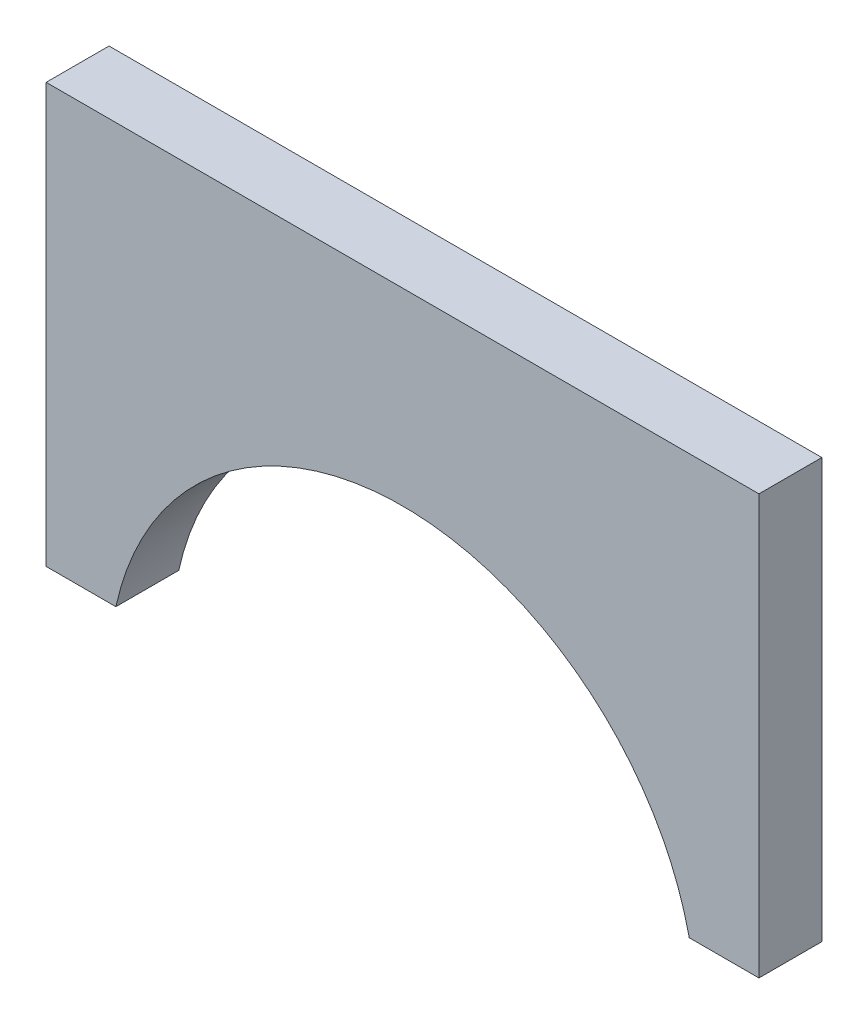
ISO-10303-21;
HEADER;
FILE_DESCRIPTION(('STEP AP214'),'2;1');
FILE_NAME('part.step','',(''),(''),'','','');
FILE_SCHEMA(('AUTOMOTIVE_DESIGN { 1 0 10303 214 1 1 1 1 }'));
ENDSEC;
DATA;
#1=APPLICATION_CONTEXT('core data for automotive mechanical design processes');
#2=APPLICATION_PROTOCOL_DEFINITION('international standard','automotive_design',2000,#1);
#3=PRODUCT_CONTEXT('',#1,'mechanical');
#4=PRODUCT('Part','Part','',(#3));
#5=PRODUCT_RELATED_PRODUCT_CATEGORY('part','',(#4));
#6=PRODUCT_DEFINITION_FORMATION('','',#4);
#7=PRODUCT_DEFINITION_CONTEXT('part definition',#1,'design');
#8=PRODUCT_DEFINITION('design','',#6,#7);
#9=PRODUCT_DEFINITION_SHAPE('','',#8);
#10=(LENGTH_UNIT() NAMED_UNIT(*) SI_UNIT(.MILLI.,.METRE.));
#11=(NAMED_UNIT(*) PLANE_ANGLE_UNIT() SI_UNIT($,.RADIAN.));
#12=(NAMED_UNIT(*) SI_UNIT($,.STERADIAN.) SOLID_ANGLE_UNIT());
#13=UNCERTAINTY_MEASURE_WITH_UNIT(LENGTH_MEASURE(1.E-05),#10,'distance_accuracy_value','');
#14=(GEOMETRIC_REPRESENTATION_CONTEXT(3) GLOBAL_UNCERTAINTY_ASSIGNED_CONTEXT((#13)) GLOBAL_UNIT_ASSIGNED_CONTEXT((#10,
#11,#12)) REPRESENTATION_CONTEXT('',''));
#15=CARTESIAN_POINT('',(0.,0.,0.));
#16=DIRECTION('',(0.,0.,1.));
#17=DIRECTION('',(1.,0.,0.));
#18=AXIS2_PLACEMENT_3D('',#15,#16,#17);
#19=CARTESIAN_POINT('',(17.,-10.,3.));
#20=DIRECTION('',(-1.,0.,0.));
#21=DIRECTION('',(0.,0.,1.));
#22=AXIS2_PLACEMENT_3D('',#19,#20,#21);
#23=PLANE('',#22);
#24=DIRECTION('',(0.,1.,0.));
#25=VECTOR('',#24,1.);
#26=CARTESIAN_POINT('',(17.,-10.,0.));
#27=LINE('',#26,#25);
#28=CARTESIAN_POINT('',(17.,-10.,0.));
#29=VERTEX_POINT('',#28);
#30=CARTESIAN_POINT('',(17.,10.,0.));
#31=VERTEX_POINT('',#30);
#32=EDGE_CURVE('E117',#29,#31,#27,.T.);
#33=ORIENTED_EDGE('',*,*,#32,.T.);
#34=DIRECTION('',(0.,0.,-1.));
#35=VECTOR('',#34,1.);
#36=CARTESIAN_POINT('',(17.,10.,3.));
#37=LINE('',#36,#35);
#38=CARTESIAN_POINT('',(17.,10.,3.));
#39=VERTEX_POINT('',#38);
#40=EDGE_CURVE('E11',#39,#31,#37,.T.);
#41=ORIENTED_EDGE('',*,*,#40,.F.);
#42=DIRECTION('',(0.,1.,0.));
#43=VECTOR('',#42,1.);
#44=CARTESIAN_POINT('',(17.,-10.,3.));
#45=LINE('',#44,#43);
#46=CARTESIAN_POINT('',(17.,-10.,3.));
#47=VERTEX_POINT('',#46);
#48=EDGE_CURVE('E127',#47,#39,#45,.T.);
#49=ORIENTED_EDGE('',*,*,#48,.F.);
#50=DIRECTION('',(0.,0.,-1.));
#51=VECTOR('',#50,1.);
#52=CARTESIAN_POINT('',(17.,-10.,3.));
#53=LINE('',#52,#51);
#54=EDGE_CURVE('E113',#47,#29,#53,.T.);
#55=ORIENTED_EDGE('',*,*,#54,.T.);
#56=EDGE_LOOP('',(#33,#41,#49,#55));
#57=FACE_BOUND('',#56,.T.);
#58=ADVANCED_FACE('F33',(#57),#23,.F.);
#59=CARTESIAN_POINT('',(-17.,10.,3.));
#60=DIRECTION('',(0.,-1.,0.));
#61=DIRECTION('',(0.,0.,-1.));
#62=AXIS2_PLACEMENT_3D('',#59,#60,#61);
#63=PLANE('',#62);
#64=DIRECTION('',(-1.,0.,0.));
#65=VECTOR('',#64,1.);
#66=CARTESIAN_POINT('',(-17.,10.,0.));
#67=LINE('',#66,#65);
#68=CARTESIAN_POINT('',(-17.,10.,0.));
#69=VERTEX_POINT('',#68);
#70=EDGE_CURVE('E120',#31,#69,#67,.T.);
#71=ORIENTED_EDGE('',*,*,#70,.T.);
#72=DIRECTION('',(0.,0.,-1.));
#73=VECTOR('',#72,1.);
#74=CARTESIAN_POINT('',(-17.,10.,3.));
#75=LINE('',#74,#73);
#76=CARTESIAN_POINT('',(-17.,10.,3.));
#77=VERTEX_POINT('',#76);
#78=EDGE_CURVE('E41',#77,#69,#75,.T.);
#79=ORIENTED_EDGE('',*,*,#78,.F.);
#80=DIRECTION('',(-1.,0.,0.));
#81=VECTOR('',#80,1.);
#82=CARTESIAN_POINT('',(-17.,10.,3.));
#83=LINE('',#82,#81);
#84=EDGE_CURVE('E86',#39,#77,#83,.T.);
#85=ORIENTED_EDGE('',*,*,#84,.F.);
#86=ORIENTED_EDGE('',*,*,#40,.T.);
#87=EDGE_LOOP('',(#71,#79,#85,#86));
#88=FACE_BOUND('',#87,.T.);
#89=ADVANCED_FACE('F151',(#88),#63,.F.);
#90=CARTESIAN_POINT('',(-17.,-10.,3.));
#91=DIRECTION('',(1.,0.,0.));
#92=DIRECTION('',(0.,0.,-1.));
#93=AXIS2_PLACEMENT_3D('',#90,#91,#92);
#94=PLANE('',#93);
#95=DIRECTION('',(0.,-1.,0.));
#96=VECTOR('',#95,1.);
#97=CARTESIAN_POINT('',(-17.,-10.,0.));
#98=LINE('',#97,#96);
#99=CARTESIAN_POINT('',(-17.,-10.,0.));
#100=VERTEX_POINT('',#99);
#101=EDGE_CURVE('E122',#69,#100,#98,.T.);
#102=ORIENTED_EDGE('',*,*,#101,.T.);
#103=DIRECTION('',(0.,0.,-1.));
#104=VECTOR('',#103,1.);
#105=CARTESIAN_POINT('',(-17.,-10.,3.));
#106=LINE('',#105,#104);
#107=CARTESIAN_POINT('',(-17.,-10.,3.));
#108=VERTEX_POINT('',#107);
#109=EDGE_CURVE('E108',#108,#100,#106,.T.);
#110=ORIENTED_EDGE('',*,*,#109,.F.);
#111=DIRECTION('',(0.,-1.,0.));
#112=VECTOR('',#111,1.);
#113=CARTESIAN_POINT('',(-17.,-10.,3.));
#114=LINE('',#113,#112);
#115=EDGE_CURVE('E99',#77,#108,#114,.T.);
#116=ORIENTED_EDGE('',*,*,#115,.F.);
#117=ORIENTED_EDGE('',*,*,#78,.T.);
#118=EDGE_LOOP('',(#102,#110,#116,#117));
#119=FACE_BOUND('',#118,.T.);
#120=ADVANCED_FACE('F133',(#119),#94,.F.);
#121=CARTESIAN_POINT('',(-17.,-10.,3.));
#122=DIRECTION('',(0.,1.,0.));
#123=DIRECTION('',(-1.,0.,0.));
#124=AXIS2_PLACEMENT_3D('',#121,#122,#123);
#125=PLANE('',#124);
#126=DIRECTION('',(1.,0.,0.));
#127=VECTOR('',#126,1.);
#128=CARTESIAN_POINT('',(-17.,-10.,0.));
#129=LINE('',#128,#127);
#130=CARTESIAN_POINT('',(-13.6747943311773,-10.,0.));
#131=VERTEX_POINT('',#130);
#132=EDGE_CURVE('E107',#100,#131,#129,.T.);
#133=ORIENTED_EDGE('',*,*,#132,.T.);
#134=DIRECTION('',(0.,0.,-1.));
#135=VECTOR('',#134,1.);
#136=CARTESIAN_POINT('',(-13.6747943311773,-10.,3.));
#137=LINE('',#136,#135);
#138=CARTESIAN_POINT('',(-13.6747943311773,-10.,3.));
#139=VERTEX_POINT('',#138);
#140=EDGE_CURVE('E104',#139,#131,#137,.T.);
#141=ORIENTED_EDGE('',*,*,#140,.F.);
#142=DIRECTION('',(1.,0.,0.));
#143=VECTOR('',#142,1.);
#144=CARTESIAN_POINT('',(-17.,-10.,3.));
#145=LINE('',#144,#143);
#146=EDGE_CURVE('E93',#108,#139,#145,.T.);
#147=ORIENTED_EDGE('',*,*,#146,.F.);
#148=ORIENTED_EDGE('',*,*,#109,.T.);
#149=EDGE_LOOP('',(#133,#141,#147,#148));
#150=FACE_BOUND('',#149,.T.);
#151=ADVANCED_FACE('F105',(#150),#125,.F.);
#152=CARTESIAN_POINT('',(0.,-13.,3.));
#153=DIRECTION('',(0.,0.,-1.));
#154=DIRECTION('',(-1.,0.,0.));
#155=AXIS2_PLACEMENT_3D('',#152,#153,#154);
#156=CYLINDRICAL_SURFACE('',#155,14.);
#157=CARTESIAN_POINT('',(0.,-13.,0.));
#158=DIRECTION('',(0.,0.,-1.));
#159=DIRECTION('',(1.,0.,0.));
#160=AXIS2_PLACEMENT_3D('',#157,#158,#159);
#161=CIRCLE('',#160,14.);
#162=CARTESIAN_POINT('',(13.6747943311774,-10.,0.));
#163=VERTEX_POINT('',#162);
#164=EDGE_CURVE('E72',#131,#163,#161,.T.);
#165=ORIENTED_EDGE('',*,*,#164,.T.);
#166=DIRECTION('',(0.,0.,-1.));
#167=VECTOR('',#166,1.);
#168=CARTESIAN_POINT('',(13.6747943311774,-10.,3.));
#169=LINE('',#168,#167);
#170=CARTESIAN_POINT('',(13.6747943311774,-10.,3.));
#171=VERTEX_POINT('',#170);
#172=EDGE_CURVE('E109',#171,#163,#169,.T.);
#173=ORIENTED_EDGE('',*,*,#172,.F.);
#174=CARTESIAN_POINT('',(0.,-13.,3.));
#175=DIRECTION('',(0.,0.,-1.));
#176=DIRECTION('',(1.,0.,0.));
#177=AXIS2_PLACEMENT_3D('',#174,#175,#176);
#178=CIRCLE('',#177,14.);
#179=EDGE_CURVE('E97',#139,#171,#178,.T.);
#180=ORIENTED_EDGE('',*,*,#179,.F.);
#181=ORIENTED_EDGE('',*,*,#140,.T.);
#182=EDGE_LOOP('',(#165,#173,#180,#181));
#183=FACE_BOUND('',#182,.T.);
#184=ADVANCED_FACE('F111',(#183),#156,.F.);
#185=CARTESIAN_POINT('',(13.6747943311774,-10.,3.));
#186=DIRECTION('',(0.,1.,0.));
#187=DIRECTION('',(-1.,0.,0.));
#188=AXIS2_PLACEMENT_3D('',#185,#186,#187);
#189=PLANE('',#188);
#190=DIRECTION('',(1.,0.,0.));
#191=VECTOR('',#190,1.);
#192=CARTESIAN_POINT('',(13.6747943311774,-10.,0.));
#193=LINE('',#192,#191);
#194=EDGE_CURVE('E78',#163,#29,#193,.T.);
#195=ORIENTED_EDGE('',*,*,#194,.T.);
#196=ORIENTED_EDGE('',*,*,#54,.F.);
#197=DIRECTION('',(1.,0.,0.));
#198=VECTOR('',#197,1.);
#199=CARTESIAN_POINT('',(13.6747943311774,-10.,3.));
#200=LINE('',#199,#198);
#201=EDGE_CURVE('E49',#171,#47,#200,.T.);
#202=ORIENTED_EDGE('',*,*,#201,.F.);
#203=ORIENTED_EDGE('',*,*,#172,.T.);
#204=EDGE_LOOP('',(#195,#196,#202,#203));
#205=FACE_BOUND('',#204,.T.);
#206=ADVANCED_FACE('F140',(#205),#189,.F.);
#207=CARTESIAN_POINT('',(0.,-13.,3.));
#208=DIRECTION('',(0.,0.,1.));
#209=DIRECTION('',(1.,0.,0.));
#210=AXIS2_PLACEMENT_3D('',#207,#208,#209);
#211=PLANE('',#210);
#212=ORIENTED_EDGE('',*,*,#48,.T.);
#213=ORIENTED_EDGE('',*,*,#84,.T.);
#214=ORIENTED_EDGE('',*,*,#115,.T.);
#215=ORIENTED_EDGE('',*,*,#146,.T.);
#216=ORIENTED_EDGE('',*,*,#179,.T.);
#217=ORIENTED_EDGE('',*,*,#201,.T.);
#218=EDGE_LOOP('',(#212,#213,#214,#215,#216,#217));
#219=FACE_BOUND('',#218,.T.);
#220=ADVANCED_FACE('F95',(#219),#211,.T.);
#221=CARTESIAN_POINT('',(0.,-13.,0.));
#222=DIRECTION('',(0.,0.,1.));
#223=DIRECTION('',(1.,0.,0.));
#224=AXIS2_PLACEMENT_3D('',#221,#222,#223);
#225=PLANE('',#224);
#226=ORIENTED_EDGE('',*,*,#32,.F.);
#227=ORIENTED_EDGE('',*,*,#194,.F.);
#228=ORIENTED_EDGE('',*,*,#164,.F.);
#229=ORIENTED_EDGE('',*,*,#132,.F.);
#230=ORIENTED_EDGE('',*,*,#101,.F.);
#231=ORIENTED_EDGE('',*,*,#70,.F.);
#232=EDGE_LOOP('',(#226,#227,#228,#229,#230,#231));
#233=FACE_BOUND('',#232,.T.);
#234=ADVANCED_FACE('F136',(#233),#225,.F.);
#235=CLOSED_SHELL('',(#58,#89,#120,#151,#184,#206,#220,#234));
#236=MANIFOLD_SOLID_BREP('B2',#235);
#237=ADVANCED_BREP_SHAPE_REPRESENTATION('',(#18,#236),#14);
#238=SHAPE_DEFINITION_REPRESENTATION(#9,#237);
ENDSEC;
END-ISO-10303-21;
